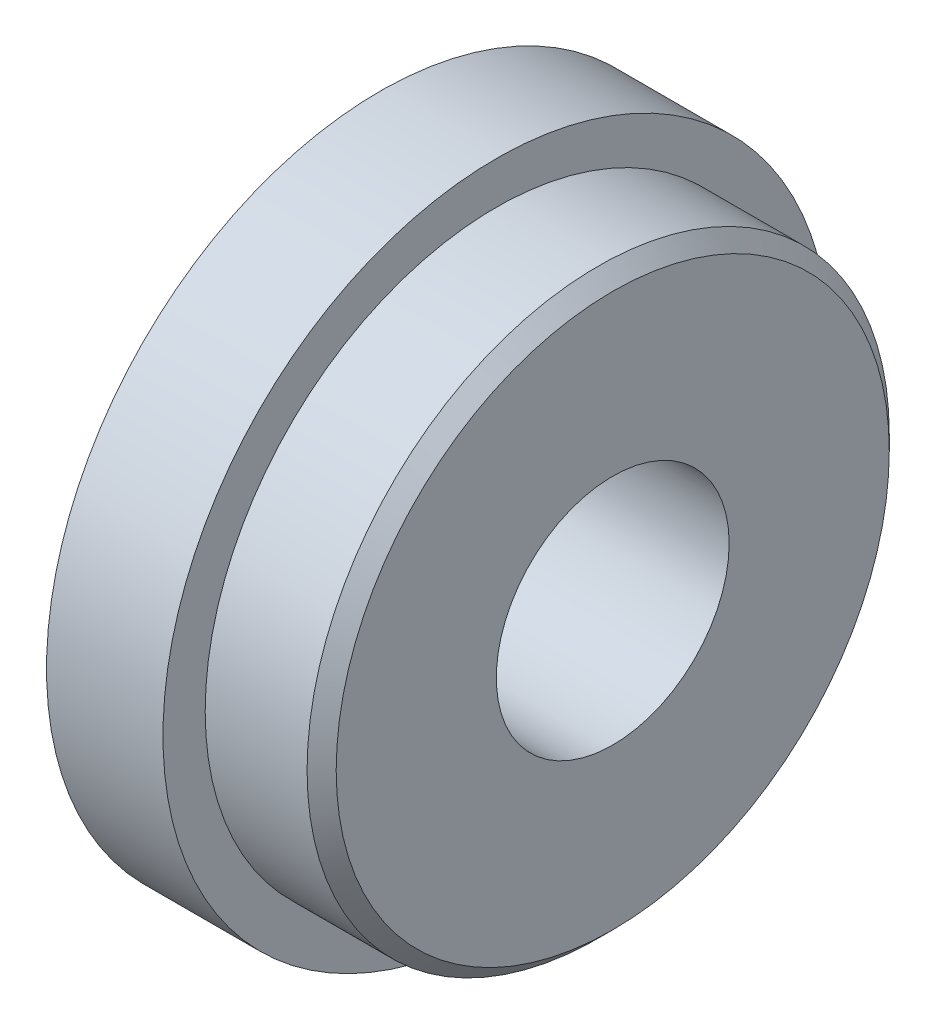
ISO-10303-21;
HEADER;
FILE_DESCRIPTION(('STEP AP214'),'2;1');
FILE_NAME('part.step','',(''),(''),'','','');
FILE_SCHEMA(('AUTOMOTIVE_DESIGN { 1 0 10303 214 1 1 1 1 }'));
ENDSEC;
DATA;
#1=APPLICATION_CONTEXT('core data for automotive mechanical design processes');
#2=APPLICATION_PROTOCOL_DEFINITION('international standard','automotive_design',2000,#1);
#3=PRODUCT_CONTEXT('',#1,'mechanical');
#4=PRODUCT('Part','Part','',(#3));
#5=PRODUCT_RELATED_PRODUCT_CATEGORY('part','',(#4));
#6=PRODUCT_DEFINITION_FORMATION('','',#4);
#7=PRODUCT_DEFINITION_CONTEXT('part definition',#1,'design');
#8=PRODUCT_DEFINITION('design','',#6,#7);
#9=PRODUCT_DEFINITION_SHAPE('','',#8);
#10=(LENGTH_UNIT() NAMED_UNIT(*) SI_UNIT(.MILLI.,.METRE.));
#11=(NAMED_UNIT(*) PLANE_ANGLE_UNIT() SI_UNIT($,.RADIAN.));
#12=(NAMED_UNIT(*) SI_UNIT($,.STERADIAN.) SOLID_ANGLE_UNIT());
#13=UNCERTAINTY_MEASURE_WITH_UNIT(LENGTH_MEASURE(1.E-05),#10,'distance_accuracy_value','');
#14=(GEOMETRIC_REPRESENTATION_CONTEXT(3) GLOBAL_UNCERTAINTY_ASSIGNED_CONTEXT((#13)) GLOBAL_UNIT_ASSIGNED_CONTEXT((#10,
#11,#12)) REPRESENTATION_CONTEXT('',''));
#15=CARTESIAN_POINT('',(0.,0.,0.));
#16=DIRECTION('',(0.,0.,1.));
#17=DIRECTION('',(1.,0.,0.));
#18=AXIS2_PLACEMENT_3D('',#15,#16,#17);
#19=CARTESIAN_POINT('',(4.,0.,0.));
#20=DIRECTION('',(-1.,0.,0.));
#21=DIRECTION('',(0.,0.,1.));
#22=AXIS2_PLACEMENT_3D('',#19,#20,#21);
#23=CYLINDRICAL_SURFACE('',#22,11.45);
#24=CARTESIAN_POINT('',(4.,0.,0.));
#25=DIRECTION('',(1.,0.,0.));
#26=DIRECTION('',(0.,0.,-1.));
#27=AXIS2_PLACEMENT_3D('',#24,#25,#26);
#28=CIRCLE('',#27,11.45);
#29=CARTESIAN_POINT('',(4.,0.,-11.45));
#30=VERTEX_POINT('',#29);
#31=EDGE_CURVE('E59',#30,#30,#28,.T.);
#32=ORIENTED_EDGE('',*,*,#31,.F.);
#33=EDGE_LOOP('',(#32));
#34=FACE_BOUND('',#33,.T.);
#35=CARTESIAN_POINT('',(0.,0.,0.));
#36=DIRECTION('',(1.,0.,0.));
#37=DIRECTION('',(0.,0.,-1.));
#38=AXIS2_PLACEMENT_3D('',#35,#36,#37);
#39=CIRCLE('',#38,11.45);
#40=CARTESIAN_POINT('',(0.,0.,-11.45));
#41=VERTEX_POINT('',#40);
#42=EDGE_CURVE('E56',#41,#41,#39,.T.);
#43=ORIENTED_EDGE('',*,*,#42,.T.);
#44=EDGE_LOOP('',(#43));
#45=FACE_BOUND('',#44,.T.);
#46=ADVANCED_FACE('F34',(#34,#45),#23,.T.);
#47=CARTESIAN_POINT('',(4.,0.,0.));
#48=DIRECTION('',(1.,0.,0.));
#49=DIRECTION('',(0.,0.,-1.));
#50=AXIS2_PLACEMENT_3D('',#47,#48,#49);
#51=PLANE('',#50);
#52=CARTESIAN_POINT('',(4.,0.,0.));
#53=DIRECTION('',(1.,0.,0.));
#54=DIRECTION('',(0.,0.,-1.));
#55=AXIS2_PLACEMENT_3D('',#52,#53,#54);
#56=CIRCLE('',#55,10.);
#57=CARTESIAN_POINT('',(4.,0.,-10.));
#58=VERTEX_POINT('',#57);
#59=EDGE_CURVE('E55',#58,#58,#56,.T.);
#60=ORIENTED_EDGE('',*,*,#59,.F.);
#61=EDGE_LOOP('',(#60));
#62=FACE_BOUND('',#61,.T.);
#63=ORIENTED_EDGE('',*,*,#31,.T.);
#64=EDGE_LOOP('',(#63));
#65=FACE_BOUND('',#64,.T.);
#66=ADVANCED_FACE('F85',(#62,#65),#51,.T.);
#67=CARTESIAN_POINT('',(0.,0.,0.));
#68=DIRECTION('',(1.,0.,0.));
#69=DIRECTION('',(0.,0.,-1.));
#70=AXIS2_PLACEMENT_3D('',#67,#68,#69);
#71=PLANE('',#70);
#72=CARTESIAN_POINT('',(0.,0.,0.));
#73=DIRECTION('',(1.,0.,0.));
#74=DIRECTION('',(0.,0.,-1.));
#75=AXIS2_PLACEMENT_3D('',#72,#73,#74);
#76=CIRCLE('',#75,4.5);
#77=CARTESIAN_POINT('',(0.,0.,-4.5));
#78=VERTEX_POINT('',#77);
#79=EDGE_CURVE('E42',#78,#78,#76,.T.);
#80=ORIENTED_EDGE('',*,*,#79,.T.);
#81=EDGE_LOOP('',(#80));
#82=FACE_BOUND('',#81,.T.);
#83=ORIENTED_EDGE('',*,*,#42,.F.);
#84=EDGE_LOOP('',(#83));
#85=FACE_BOUND('',#84,.T.);
#86=ADVANCED_FACE('F81',(#82,#85),#71,.F.);
#87=CARTESIAN_POINT('',(8.,0.,0.));
#88=DIRECTION('',(-1.,0.,0.));
#89=DIRECTION('',(0.,0.,1.));
#90=AXIS2_PLACEMENT_3D('',#87,#88,#89);
#91=CYLINDRICAL_SURFACE('',#90,10.);
#92=CARTESIAN_POINT('',(7.5,0.,0.));
#93=DIRECTION('',(1.,0.,0.));
#94=DIRECTION('',(0.,0.,-1.));
#95=AXIS2_PLACEMENT_3D('',#92,#93,#94);
#96=CIRCLE('',#95,10.);
#97=CARTESIAN_POINT('',(7.5,0.,-10.));
#98=VERTEX_POINT('',#97);
#99=EDGE_CURVE('E46',#98,#98,#96,.F.);
#100=ORIENTED_EDGE('',*,*,#99,.T.);
#101=EDGE_LOOP('',(#100));
#102=FACE_BOUND('',#101,.T.);
#103=ORIENTED_EDGE('',*,*,#59,.T.);
#104=EDGE_LOOP('',(#103));
#105=FACE_BOUND('',#104,.T.);
#106=ADVANCED_FACE('F72',(#102,#105),#91,.T.);
#107=CARTESIAN_POINT('',(8.,0.,0.));
#108=DIRECTION('',(1.,0.,0.));
#109=DIRECTION('',(0.,0.,-1.));
#110=AXIS2_PLACEMENT_3D('',#107,#108,#109);
#111=PLANE('',#110);
#112=CARTESIAN_POINT('',(8.,0.,0.));
#113=DIRECTION('',(1.,0.,0.));
#114=DIRECTION('',(0.,0.,-1.));
#115=AXIS2_PLACEMENT_3D('',#112,#113,#114);
#116=CIRCLE('',#115,9.50000000000001);
#117=CARTESIAN_POINT('',(8.,0.,-9.50000000000001));
#118=VERTEX_POINT('',#117);
#119=EDGE_CURVE('E50',#118,#118,#116,.T.);
#120=ORIENTED_EDGE('',*,*,#119,.T.);
#121=EDGE_LOOP('',(#120));
#122=FACE_BOUND('',#121,.T.);
#123=CARTESIAN_POINT('',(8.,0.,0.));
#124=DIRECTION('',(1.,0.,0.));
#125=DIRECTION('',(0.,0.,-1.));
#126=AXIS2_PLACEMENT_3D('',#123,#124,#125);
#127=CIRCLE('',#126,4.);
#128=CARTESIAN_POINT('',(8.,0.,-4.));
#129=VERTEX_POINT('',#128);
#130=EDGE_CURVE('E60',#129,#129,#127,.T.);
#131=ORIENTED_EDGE('',*,*,#130,.F.);
#132=EDGE_LOOP('',(#131));
#133=FACE_BOUND('',#132,.T.);
#134=ADVANCED_FACE('F70',(#122,#133),#111,.T.);
#135=CARTESIAN_POINT('',(0.,0.,0.));
#136=DIRECTION('',(1.,0.,0.));
#137=DIRECTION('',(0.,0.,-1.));
#138=AXIS2_PLACEMENT_3D('',#135,#136,#137);
#139=CYLINDRICAL_SURFACE('',#138,4.);
#140=CARTESIAN_POINT('',(0.5,0.,0.));
#141=DIRECTION('',(1.,0.,0.));
#142=DIRECTION('',(0.,0.,-1.));
#143=AXIS2_PLACEMENT_3D('',#140,#141,#142);
#144=CIRCLE('',#143,4.);
#145=CARTESIAN_POINT('',(0.5,0.,-4.));
#146=VERTEX_POINT('',#145);
#147=EDGE_CURVE('E10',#146,#146,#144,.F.);
#148=ORIENTED_EDGE('',*,*,#147,.T.);
#149=EDGE_LOOP('',(#148));
#150=FACE_BOUND('',#149,.T.);
#151=ORIENTED_EDGE('',*,*,#130,.T.);
#152=EDGE_LOOP('',(#151));
#153=FACE_BOUND('',#152,.T.);
#154=ADVANCED_FACE('F68',(#150,#153),#139,.F.);
#155=CARTESIAN_POINT('',(8.,0.,0.));
#156=DIRECTION('',(-1.,0.,0.));
#157=DIRECTION('',(0.,0.,1.));
#158=AXIS2_PLACEMENT_3D('',#155,#156,#157);
#159=CONICAL_SURFACE('',#158,9.50000000000001,0.785398163397441);
#160=ORIENTED_EDGE('',*,*,#99,.F.);
#161=EDGE_LOOP('',(#160));
#162=FACE_BOUND('',#161,.T.);
#163=ORIENTED_EDGE('',*,*,#119,.F.);
#164=EDGE_LOOP('',(#163));
#165=FACE_BOUND('',#164,.T.);
#166=ADVANCED_FACE('F79',(#162,#165),#159,.T.);
#167=CARTESIAN_POINT('',(0.,0.,0.));
#168=DIRECTION('',(-1.,0.,0.));
#169=DIRECTION('',(0.,0.,1.));
#170=AXIS2_PLACEMENT_3D('',#167,#168,#169);
#171=CONICAL_SURFACE('',#170,4.5,0.785398163397445);
#172=ORIENTED_EDGE('',*,*,#147,.F.);
#173=EDGE_LOOP('',(#172));
#174=FACE_BOUND('',#173,.T.);
#175=ORIENTED_EDGE('',*,*,#79,.F.);
#176=EDGE_LOOP('',(#175));
#177=FACE_BOUND('',#176,.T.);
#178=ADVANCED_FACE('F37',(#174,#177),#171,.F.);
#179=CLOSED_SHELL('',(#46,#66,#86,#106,#134,#154,#166,#178));
#180=MANIFOLD_SOLID_BREP('B2',#179);
#181=ADVANCED_BREP_SHAPE_REPRESENTATION('',(#18,#180),#14);
#182=SHAPE_DEFINITION_REPRESENTATION(#9,#181);
ENDSEC;
END-ISO-10303-21;
